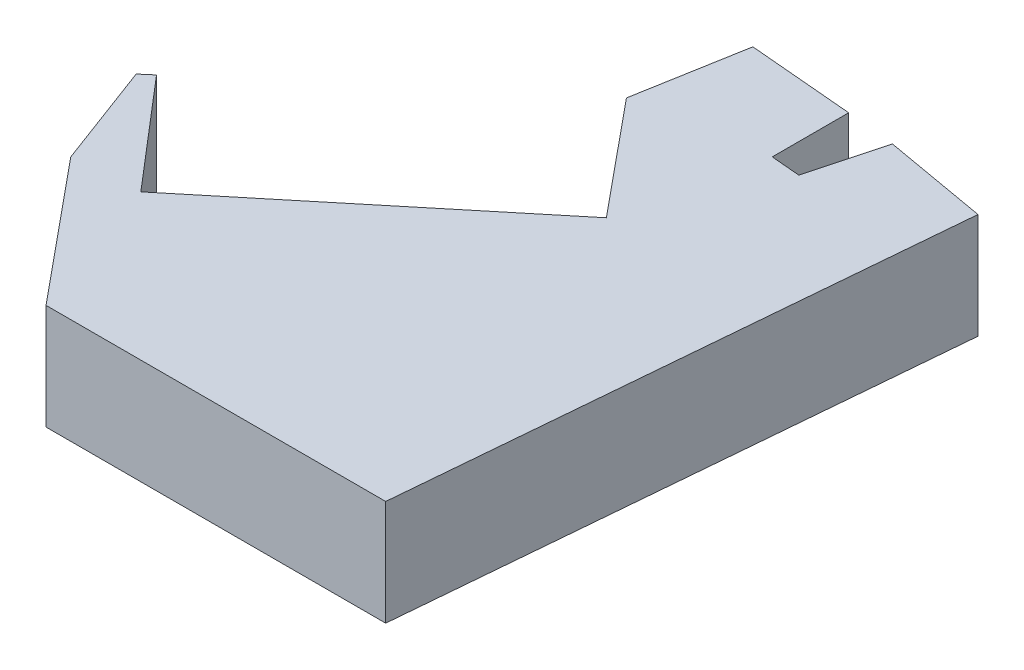
ISO-10303-21;
HEADER;
FILE_DESCRIPTION(('STEP AP214'),'2;1');
FILE_NAME('part.step','',(''),(''),'','','');
FILE_SCHEMA(('AUTOMOTIVE_DESIGN { 1 0 10303 214 1 1 1 1 }'));
ENDSEC;
DATA;
#1=APPLICATION_CONTEXT('core data for automotive mechanical design processes');
#2=APPLICATION_PROTOCOL_DEFINITION('international standard','automotive_design',2000,#1);
#3=PRODUCT_CONTEXT('',#1,'mechanical');
#4=PRODUCT('Part','Part','',(#3));
#5=PRODUCT_RELATED_PRODUCT_CATEGORY('part','',(#4));
#6=PRODUCT_DEFINITION_FORMATION('','',#4);
#7=PRODUCT_DEFINITION_CONTEXT('part definition',#1,'design');
#8=PRODUCT_DEFINITION('design','',#6,#7);
#9=PRODUCT_DEFINITION_SHAPE('','',#8);
#10=(LENGTH_UNIT() NAMED_UNIT(*) SI_UNIT(.MILLI.,.METRE.));
#11=(NAMED_UNIT(*) PLANE_ANGLE_UNIT() SI_UNIT($,.RADIAN.));
#12=(NAMED_UNIT(*) SI_UNIT($,.STERADIAN.) SOLID_ANGLE_UNIT());
#13=UNCERTAINTY_MEASURE_WITH_UNIT(LENGTH_MEASURE(1.E-05),#10,'distance_accuracy_value','');
#14=(GEOMETRIC_REPRESENTATION_CONTEXT(3) GLOBAL_UNCERTAINTY_ASSIGNED_CONTEXT((#13)) GLOBAL_UNIT_ASSIGNED_CONTEXT((#10,
#11,#12)) REPRESENTATION_CONTEXT('',''));
#15=CARTESIAN_POINT('',(0.,0.,0.));
#16=DIRECTION('',(0.,0.,1.));
#17=DIRECTION('',(1.,0.,0.));
#18=AXIS2_PLACEMENT_3D('',#15,#16,#17);
#19=CARTESIAN_POINT('',(0.,18.,0.));
#20=DIRECTION('',(0.771700164205839,0.,-0.635986522313706));
#21=DIRECTION('',(-0.635986522313706,0.,-0.771700164205839));
#22=AXIS2_PLACEMENT_3D('',#19,#20,#21);
#23=PLANE('',#22);
#24=DIRECTION('',(0.635986522313706,0.,0.771700164205839));
#25=VECTOR('',#24,1.);
#26=CARTESIAN_POINT('',(0.,0.,0.));
#27=LINE('',#26,#25);
#28=CARTESIAN_POINT('',(-19.8335297427731,0.,-24.0658215579761));
#29=VERTEX_POINT('',#28);
#30=CARTESIAN_POINT('',(0.,0.,0.));
#31=VERTEX_POINT('',#30);
#32=EDGE_CURVE('E167',#29,#31,#27,.T.);
#33=ORIENTED_EDGE('',*,*,#32,.T.);
#34=DIRECTION('',(0.,-1.,0.));
#35=VECTOR('',#34,1.);
#36=CARTESIAN_POINT('',(0.,18.,0.));
#37=LINE('',#36,#35);
#38=CARTESIAN_POINT('',(0.,18.,0.));
#39=VERTEX_POINT('',#38);
#40=EDGE_CURVE('E11',#39,#31,#37,.T.);
#41=ORIENTED_EDGE('',*,*,#40,.F.);
#42=DIRECTION('',(0.635986522313706,0.,0.771700164205839));
#43=VECTOR('',#42,1.);
#44=CARTESIAN_POINT('',(0.,18.,0.));
#45=LINE('',#44,#43);
#46=CARTESIAN_POINT('',(-19.8335297427731,18.,-24.0658215579761));
#47=VERTEX_POINT('',#46);
#48=EDGE_CURVE('E193',#47,#39,#45,.T.);
#49=ORIENTED_EDGE('',*,*,#48,.F.);
#50=DIRECTION('',(0.,-1.,0.));
#51=VECTOR('',#50,1.);
#52=CARTESIAN_POINT('',(-19.8335297427731,18.,-24.0658215579761));
#53=LINE('',#52,#51);
#54=EDGE_CURVE('E163',#47,#29,#53,.T.);
#55=ORIENTED_EDGE('',*,*,#54,.T.);
#56=EDGE_LOOP('',(#33,#41,#49,#55));
#57=FACE_BOUND('',#56,.T.);
#58=ADVANCED_FACE('F35',(#57),#23,.F.);
#59=CARTESIAN_POINT('',(0.,18.,0.));
#60=DIRECTION('',(0.,0.,-1.));
#61=DIRECTION('',(-1.,0.,0.));
#62=AXIS2_PLACEMENT_3D('',#59,#60,#61);
#63=PLANE('',#62);
#64=DIRECTION('',(1.,0.,0.));
#65=VECTOR('',#64,1.);
#66=CARTESIAN_POINT('',(0.,0.,0.));
#67=LINE('',#66,#65);
#68=CARTESIAN_POINT('',(58.,0.,0.));
#69=VERTEX_POINT('',#68);
#70=EDGE_CURVE('E170',#31,#69,#67,.T.);
#71=ORIENTED_EDGE('',*,*,#70,.T.);
#72=DIRECTION('',(0.,-1.,0.));
#73=VECTOR('',#72,1.);
#74=CARTESIAN_POINT('',(58.,18.,0.));
#75=LINE('',#74,#73);
#76=CARTESIAN_POINT('',(58.,18.,0.));
#77=VERTEX_POINT('',#76);
#78=EDGE_CURVE('E43',#77,#69,#75,.T.);
#79=ORIENTED_EDGE('',*,*,#78,.F.);
#80=DIRECTION('',(1.,0.,0.));
#81=VECTOR('',#80,1.);
#82=CARTESIAN_POINT('',(0.,18.,0.));
#83=LINE('',#82,#81);
#84=EDGE_CURVE('E112',#39,#77,#83,.T.);
#85=ORIENTED_EDGE('',*,*,#84,.F.);
#86=ORIENTED_EDGE('',*,*,#40,.T.);
#87=EDGE_LOOP('',(#71,#79,#85,#86));
#88=FACE_BOUND('',#87,.T.);
#89=ADVANCED_FACE('F281',(#88),#63,.F.);
#90=CARTESIAN_POINT('',(58.,18.,0.));
#91=DIRECTION('',(-0.996194698091746,0.,-0.0871557427476544));
#92=DIRECTION('',(-0.0871557427476544,0.,0.996194698091746));
#93=AXIS2_PLACEMENT_3D('',#90,#91,#92);
#94=PLANE('',#93);
#95=DIRECTION('',(0.0871557427476544,0.,-0.996194698091746));
#96=VECTOR('',#95,1.);
#97=CARTESIAN_POINT('',(58.,0.,0.));
#98=LINE('',#97,#96);
#99=CARTESIAN_POINT('',(66.1364457079106,0.,-93.));
#100=VERTEX_POINT('',#99);
#101=EDGE_CURVE('E172',#69,#100,#98,.T.);
#102=ORIENTED_EDGE('',*,*,#101,.T.);
#103=DIRECTION('',(0.,-1.,0.));
#104=VECTOR('',#103,1.);
#105=CARTESIAN_POINT('',(66.1364457079106,18.,-93.));
#106=LINE('',#105,#104);
#107=CARTESIAN_POINT('',(66.1364457079106,18.,-93.));
#108=VERTEX_POINT('',#107);
#109=EDGE_CURVE('E218',#108,#100,#106,.T.);
#110=ORIENTED_EDGE('',*,*,#109,.F.);
#111=DIRECTION('',(0.0871557427476544,0.,-0.996194698091746));
#112=VECTOR('',#111,1.);
#113=CARTESIAN_POINT('',(58.,18.,0.));
#114=LINE('',#113,#112);
#115=EDGE_CURVE('E226',#77,#108,#114,.T.);
#116=ORIENTED_EDGE('',*,*,#115,.F.);
#117=ORIENTED_EDGE('',*,*,#78,.T.);
#118=EDGE_LOOP('',(#102,#110,#116,#117));
#119=FACE_BOUND('',#118,.T.);
#120=ADVANCED_FACE('F224',(#119),#94,.F.);
#121=CARTESIAN_POINT('',(66.1364457079106,18.,-93.));
#122=DIRECTION('',(-0.173648177666924,0.,0.984807753012209));
#123=DIRECTION('',(0.984807753012209,0.,0.173648177666924));
#124=AXIS2_PLACEMENT_3D('',#121,#122,#123);
#125=PLANE('',#124);
#126=DIRECTION('',(-0.984807753012209,0.,-0.173648177666924));
#127=VECTOR('',#126,1.);
#128=CARTESIAN_POINT('',(66.1364457079106,0.,-93.));
#129=LINE('',#128,#127);
#130=CARTESIAN_POINT('',(48.4099061536908,0.,-96.1256671980046));
#131=VERTEX_POINT('',#130);
#132=EDGE_CURVE('E174',#100,#131,#129,.T.);
#133=ORIENTED_EDGE('',*,*,#132,.T.);
#134=DIRECTION('',(0.,-1.,0.));
#135=VECTOR('',#134,1.);
#136=CARTESIAN_POINT('',(48.4099061536908,18.,-96.1256671980046));
#137=LINE('',#136,#135);
#138=CARTESIAN_POINT('',(48.4099061536908,18.,-96.1256671980046));
#139=VERTEX_POINT('',#138);
#140=EDGE_CURVE('E215',#139,#131,#137,.T.);
#141=ORIENTED_EDGE('',*,*,#140,.F.);
#142=DIRECTION('',(-0.984807753012209,0.,-0.173648177666924));
#143=VECTOR('',#142,1.);
#144=CARTESIAN_POINT('',(66.1364457079106,18.,-93.));
#145=LINE('',#144,#143);
#146=EDGE_CURVE('E244',#108,#139,#145,.T.);
#147=ORIENTED_EDGE('',*,*,#146,.F.);
#148=ORIENTED_EDGE('',*,*,#109,.T.);
#149=EDGE_LOOP('',(#133,#141,#147,#148));
#150=FACE_BOUND('',#149,.T.);
#151=ADVANCED_FACE('F235',(#150),#125,.F.);
#152=CARTESIAN_POINT('',(48.4099061536908,18.,-96.1256671980046));
#153=DIRECTION('',(0.965925826289071,0.,0.258819045102511));
#154=DIRECTION('',(0.258819045102511,0.,-0.965925826289071));
#155=AXIS2_PLACEMENT_3D('',#152,#153,#154);
#156=PLANE('',#155);
#157=DIRECTION('',(-0.258819045102511,0.,0.965925826289071));
#158=VECTOR('',#157,1.);
#159=CARTESIAN_POINT('',(48.4099061536908,0.,-96.1256671980046));
#160=LINE('',#159,#158);
#161=CARTESIAN_POINT('',(45.0324061601878,0.,-83.5206656196872));
#162=VERTEX_POINT('',#161);
#163=EDGE_CURVE('E176',#131,#162,#160,.T.);
#164=ORIENTED_EDGE('',*,*,#163,.T.);
#165=DIRECTION('',(0.,-1.,0.));
#166=VECTOR('',#165,1.);
#167=CARTESIAN_POINT('',(45.0324061601878,18.,-83.5206656196872));
#168=LINE('',#167,#166);
#169=CARTESIAN_POINT('',(45.0324061601878,18.,-83.5206656196872));
#170=VERTEX_POINT('',#169);
#171=EDGE_CURVE('E212',#170,#162,#168,.T.);
#172=ORIENTED_EDGE('',*,*,#171,.F.);
#173=DIRECTION('',(-0.258819045102511,0.,0.965925826289071));
#174=VECTOR('',#173,1.);
#175=CARTESIAN_POINT('',(48.4099061536908,18.,-96.1256671980046));
#176=LINE('',#175,#174);
#177=EDGE_CURVE('E241',#139,#170,#176,.T.);
#178=ORIENTED_EDGE('',*,*,#177,.F.);
#179=ORIENTED_EDGE('',*,*,#140,.T.);
#180=EDGE_LOOP('',(#164,#172,#178,#179));
#181=FACE_BOUND('',#180,.T.);
#182=ADVANCED_FACE('F239',(#181),#156,.F.);
#183=CARTESIAN_POINT('',(45.0324061601878,18.,-83.5206656196872));
#184=DIRECTION('',(-0.0871557427476548,0.,0.996194698091746));
#185=DIRECTION('',(0.996194698091746,0.,0.0871557427476548));
#186=AXIS2_PLACEMENT_3D('',#183,#184,#185);
#187=PLANE('',#186);
#188=DIRECTION('',(-0.996194698091746,0.,-0.0871557427476548));
#189=VECTOR('',#188,1.);
#190=CARTESIAN_POINT('',(45.0324061601878,0.,-83.5206656196872));
#191=LINE('',#190,#189);
#192=CARTESIAN_POINT('',(40.051432669729,0.,-83.9564443334254));
#193=VERTEX_POINT('',#192);
#194=EDGE_CURVE('E178',#162,#193,#191,.T.);
#195=ORIENTED_EDGE('',*,*,#194,.T.);
#196=DIRECTION('',(0.,-1.,0.));
#197=VECTOR('',#196,1.);
#198=CARTESIAN_POINT('',(40.051432669729,18.,-83.9564443334254));
#199=LINE('',#198,#197);
#200=CARTESIAN_POINT('',(40.051432669729,18.,-83.9564443334254));
#201=VERTEX_POINT('',#200);
#202=EDGE_CURVE('E209',#201,#193,#199,.T.);
#203=ORIENTED_EDGE('',*,*,#202,.F.);
#204=DIRECTION('',(-0.996194698091746,0.,-0.0871557427476548));
#205=VECTOR('',#204,1.);
#206=CARTESIAN_POINT('',(45.0324061601878,18.,-83.5206656196872));
#207=LINE('',#206,#205);
#208=EDGE_CURVE('E243',#170,#201,#207,.T.);
#209=ORIENTED_EDGE('',*,*,#208,.F.);
#210=ORIENTED_EDGE('',*,*,#171,.T.);
#211=EDGE_LOOP('',(#195,#203,#209,#210));
#212=FACE_BOUND('',#211,.T.);
#213=ADVANCED_FACE('F294',(#212),#187,.F.);
#214=CARTESIAN_POINT('',(40.051432669729,18.,-83.9564443334254));
#215=DIRECTION('',(-1.,0.,0.));
#216=DIRECTION('',(0.,0.,1.));
#217=AXIS2_PLACEMENT_3D('',#214,#215,#216);
#218=PLANE('',#217);
#219=DIRECTION('',(0.,0.,-1.));
#220=VECTOR('',#219,1.);
#221=CARTESIAN_POINT('',(40.051432669729,0.,-83.9564443334254));
#222=LINE('',#221,#220);
#223=CARTESIAN_POINT('',(40.051432669729,0.,-97.0061022214889));
#224=VERTEX_POINT('',#223);
#225=EDGE_CURVE('E180',#193,#224,#222,.T.);
#226=ORIENTED_EDGE('',*,*,#225,.T.);
#227=DIRECTION('',(0.,-1.,0.));
#228=VECTOR('',#227,1.);
#229=CARTESIAN_POINT('',(40.051432669729,18.,-97.0061022214889));
#230=LINE('',#229,#228);
#231=CARTESIAN_POINT('',(40.051432669729,18.,-97.0061022214889));
#232=VERTEX_POINT('',#231);
#233=EDGE_CURVE('E206',#232,#224,#230,.T.);
#234=ORIENTED_EDGE('',*,*,#233,.F.);
#235=DIRECTION('',(0.,0.,-1.));
#236=VECTOR('',#235,1.);
#237=CARTESIAN_POINT('',(40.051432669729,18.,-83.9564443334254));
#238=LINE('',#237,#236);
#239=EDGE_CURVE('E246',#201,#232,#238,.T.);
#240=ORIENTED_EDGE('',*,*,#239,.F.);
#241=ORIENTED_EDGE('',*,*,#202,.T.);
#242=EDGE_LOOP('',(#226,#234,#240,#241));
#243=FACE_BOUND('',#242,.T.);
#244=ADVANCED_FACE('F297',(#243),#218,.F.);
#245=CARTESIAN_POINT('',(40.051432669729,18.,-97.0061022214889));
#246=DIRECTION('',(-0.0871557427476512,0.,0.996194698091746));
#247=DIRECTION('',(0.996194698091746,0.,0.0871557427476512));
#248=AXIS2_PLACEMENT_3D('',#245,#246,#247);
#249=PLANE('',#248);
#250=DIRECTION('',(-0.996194698091746,0.,-0.0871557427476512));
#251=VECTOR('',#250,1.);
#252=CARTESIAN_POINT('',(40.051432669729,0.,-97.0061022214889));
#253=LINE('',#252,#251);
#254=CARTESIAN_POINT('',(22.1199281040776,0.,-98.5749055909467));
#255=VERTEX_POINT('',#254);
#256=EDGE_CURVE('E182',#224,#255,#253,.T.);
#257=ORIENTED_EDGE('',*,*,#256,.T.);
#258=DIRECTION('',(0.,-1.,0.));
#259=VECTOR('',#258,1.);
#260=CARTESIAN_POINT('',(22.1199281040776,18.,-98.5749055909467));
#261=LINE('',#260,#259);
#262=CARTESIAN_POINT('',(22.1199281040776,18.,-98.5749055909467));
#263=VERTEX_POINT('',#262);
#264=EDGE_CURVE('E203',#263,#255,#261,.T.);
#265=ORIENTED_EDGE('',*,*,#264,.F.);
#266=DIRECTION('',(-0.996194698091746,0.,-0.0871557427476512));
#267=VECTOR('',#266,1.);
#268=CARTESIAN_POINT('',(40.051432669729,18.,-97.0061022214889));
#269=LINE('',#268,#267);
#270=EDGE_CURVE('E252',#232,#263,#269,.T.);
#271=ORIENTED_EDGE('',*,*,#270,.F.);
#272=ORIENTED_EDGE('',*,*,#233,.T.);
#273=EDGE_LOOP('',(#257,#265,#271,#272));
#274=FACE_BOUND('',#273,.T.);
#275=ADVANCED_FACE('F301',(#274),#249,.F.);
#276=CARTESIAN_POINT('',(22.1199281040776,18.,-98.5749055909467));
#277=DIRECTION('',(0.98480775301221,0.,0.17364817766692));
#278=DIRECTION('',(0.17364817766692,0.,-0.98480775301221));
#279=AXIS2_PLACEMENT_3D('',#276,#277,#278);
#280=PLANE('',#279);
#281=DIRECTION('',(-0.17364817766692,0.,0.98480775301221));
#282=VECTOR('',#281,1.);
#283=CARTESIAN_POINT('',(22.1199281040776,0.,-98.5749055909467));
#284=LINE('',#283,#282);
#285=CARTESIAN_POINT('',(18.8832214469573,0.,-80.2186299709839));
#286=VERTEX_POINT('',#285);
#287=EDGE_CURVE('E184',#255,#286,#284,.T.);
#288=ORIENTED_EDGE('',*,*,#287,.T.);
#289=DIRECTION('',(0.,-1.,0.));
#290=VECTOR('',#289,1.);
#291=CARTESIAN_POINT('',(18.8832214469573,18.,-80.2186299709839));
#292=LINE('',#291,#290);
#293=CARTESIAN_POINT('',(18.8832214469573,18.,-80.2186299709839));
#294=VERTEX_POINT('',#293);
#295=EDGE_CURVE('E200',#294,#286,#292,.T.);
#296=ORIENTED_EDGE('',*,*,#295,.F.);
#297=DIRECTION('',(-0.17364817766692,0.,0.98480775301221));
#298=VECTOR('',#297,1.);
#299=CARTESIAN_POINT('',(22.1199281040776,18.,-98.5749055909467));
#300=LINE('',#299,#298);
#301=EDGE_CURVE('E254',#263,#294,#300,.T.);
#302=ORIENTED_EDGE('',*,*,#301,.F.);
#303=ORIENTED_EDGE('',*,*,#264,.T.);
#304=EDGE_LOOP('',(#288,#296,#302,#303));
#305=FACE_BOUND('',#304,.T.);
#306=ADVANCED_FACE('F305',(#305),#280,.F.);
#307=CARTESIAN_POINT('',(34.8936794858975,18.,-60.79168826047));
#308=DIRECTION('',(0.771700164205839,0.,-0.635986522313706));
#309=DIRECTION('',(-0.635986522313706,0.,-0.771700164205839));
#310=AXIS2_PLACEMENT_3D('',#307,#308,#309);
#311=PLANE('',#310);
#312=DIRECTION('',(0.635986522313706,0.,0.771700164205839));
#313=VECTOR('',#312,1.);
#314=CARTESIAN_POINT('',(34.8936794858975,0.,-60.79168826047));
#315=LINE('',#314,#313);
#316=CARTESIAN_POINT('',(34.8936794858975,0.,-60.79168826047));
#317=VERTEX_POINT('',#316);
#318=EDGE_CURVE('E186',#286,#317,#315,.T.);
#319=ORIENTED_EDGE('',*,*,#318,.T.);
#320=DIRECTION('',(0.,-1.,0.));
#321=VECTOR('',#320,1.);
#322=CARTESIAN_POINT('',(34.8936794858975,18.,-60.79168826047));
#323=LINE('',#322,#321);
#324=CARTESIAN_POINT('',(34.8936794858975,18.,-60.79168826047));
#325=VERTEX_POINT('',#324);
#326=EDGE_CURVE('E197',#325,#317,#323,.T.);
#327=ORIENTED_EDGE('',*,*,#326,.F.);
#328=DIRECTION('',(0.635986522313706,0.,0.771700164205839));
#329=VECTOR('',#328,1.);
#330=CARTESIAN_POINT('',(34.8936794858975,18.,-60.79168826047));
#331=LINE('',#330,#329);
#332=EDGE_CURVE('E256',#294,#325,#331,.T.);
#333=ORIENTED_EDGE('',*,*,#332,.F.);
#334=ORIENTED_EDGE('',*,*,#295,.T.);
#335=EDGE_LOOP('',(#319,#327,#333,#334));
#336=FACE_BOUND('',#335,.T.);
#337=ADVANCED_FACE('F262',(#336),#311,.F.);
#338=CARTESIAN_POINT('',(-8.6850884928201,18.,-24.8768208300313));
#339=DIRECTION('',(0.635986522313706,0.,0.771700164205839));
#340=DIRECTION('',(0.771700164205839,0.,-0.635986522313706));
#341=AXIS2_PLACEMENT_3D('',#338,#339,#340);
#342=PLANE('',#341);
#343=DIRECTION('',(-0.771700164205839,0.,0.635986522313706));
#344=VECTOR('',#343,1.);
#345=CARTESIAN_POINT('',(-8.6850884928201,0.,-24.8768208300313));
#346=LINE('',#345,#344);
#347=CARTESIAN_POINT('',(-8.6850884928201,0.,-24.8768208300313));
#348=VERTEX_POINT('',#347);
#349=EDGE_CURVE('E188',#317,#348,#346,.T.);
#350=ORIENTED_EDGE('',*,*,#349,.T.);
#351=DIRECTION('',(0.,-1.,0.));
#352=VECTOR('',#351,1.);
#353=CARTESIAN_POINT('',(-8.6850884928201,18.,-24.8768208300313));
#354=LINE('',#353,#352);
#355=CARTESIAN_POINT('',(-8.6850884928201,18.,-24.8768208300313));
#356=VERTEX_POINT('',#355);
#357=EDGE_CURVE('E158',#356,#348,#354,.T.);
#358=ORIENTED_EDGE('',*,*,#357,.F.);
#359=DIRECTION('',(-0.771700164205839,0.,0.635986522313706));
#360=VECTOR('',#359,1.);
#361=CARTESIAN_POINT('',(-8.6850884928201,18.,-24.8768208300313));
#362=LINE('',#361,#360);
#363=EDGE_CURVE('E149',#325,#356,#362,.T.);
#364=ORIENTED_EDGE('',*,*,#363,.F.);
#365=ORIENTED_EDGE('',*,*,#326,.T.);
#366=EDGE_LOOP('',(#350,#358,#364,#365));
#367=FACE_BOUND('',#366,.T.);
#368=ADVANCED_FACE('F266',(#367),#342,.F.);
#369=CARTESIAN_POINT('',(-24.6350939992342,18.,-43.5035697620843));
#370=DIRECTION('',(-0.759574456156183,0.,0.650420360655353));
#371=DIRECTION('',(0.650420360655353,0.,0.759574456156183));
#372=AXIS2_PLACEMENT_3D('',#369,#370,#371);
#373=PLANE('',#372);
#374=DIRECTION('',(-0.650420360655353,0.,-0.759574456156183));
#375=VECTOR('',#374,1.);
#376=CARTESIAN_POINT('',(-24.6350939992342,0.,-43.5035697620843));
#377=LINE('',#376,#375);
#378=CARTESIAN_POINT('',(-24.6350939992342,0.,-43.5035697620843));
#379=VERTEX_POINT('',#378);
#380=EDGE_CURVE('E157',#348,#379,#377,.T.);
#381=ORIENTED_EDGE('',*,*,#380,.T.);
#382=DIRECTION('',(0.,-1.,0.));
#383=VECTOR('',#382,1.);
#384=CARTESIAN_POINT('',(-24.6350939992342,18.,-43.5035697620843));
#385=LINE('',#384,#383);
#386=CARTESIAN_POINT('',(-24.6350939992342,18.,-43.5035697620843));
#387=VERTEX_POINT('',#386);
#388=EDGE_CURVE('E154',#387,#379,#385,.T.);
#389=ORIENTED_EDGE('',*,*,#388,.F.);
#390=DIRECTION('',(-0.650420360655353,0.,-0.759574456156183));
#391=VECTOR('',#390,1.);
#392=CARTESIAN_POINT('',(-24.6350939992342,18.,-43.5035697620843));
#393=LINE('',#392,#391);
#394=EDGE_CURVE('E143',#356,#387,#393,.T.);
#395=ORIENTED_EDGE('',*,*,#394,.F.);
#396=ORIENTED_EDGE('',*,*,#357,.T.);
#397=EDGE_LOOP('',(#381,#389,#395,#396));
#398=FACE_BOUND('',#397,.T.);
#399=ADVANCED_FACE('F155',(#398),#373,.F.);
#400=CARTESIAN_POINT('',(-24.6350939992342,18.,-43.5035697620843));
#401=DIRECTION('',(0.650420360655353,0.,0.759574456156182));
#402=DIRECTION('',(0.759574456156183,0.,-0.650420360655353));
#403=AXIS2_PLACEMENT_3D('',#400,#401,#402);
#404=PLANE('',#403);
#405=DIRECTION('',(-0.759574456156183,0.,0.650420360655353));
#406=VECTOR('',#405,1.);
#407=CARTESIAN_POINT('',(-24.6350939992342,0.,-43.5035697620843));
#408=LINE('',#407,#406);
#409=CARTESIAN_POINT('',(-26.5059232604727,0.,-41.9015866609449));
#410=VERTEX_POINT('',#409);
#411=EDGE_CURVE('E98',#379,#410,#408,.T.);
#412=ORIENTED_EDGE('',*,*,#411,.T.);
#413=DIRECTION('',(0.,-1.,0.));
#414=VECTOR('',#413,1.);
#415=CARTESIAN_POINT('',(-26.5059232604727,18.,-41.9015866609449));
#416=LINE('',#415,#414);
#417=CARTESIAN_POINT('',(-26.5059232604727,18.,-41.9015866609449));
#418=VERTEX_POINT('',#417);
#419=EDGE_CURVE('E159',#418,#410,#416,.T.);
#420=ORIENTED_EDGE('',*,*,#419,.F.);
#421=DIRECTION('',(-0.759574456156183,0.,0.650420360655353));
#422=VECTOR('',#421,1.);
#423=CARTESIAN_POINT('',(-24.6350939992342,18.,-43.5035697620843));
#424=LINE('',#423,#422);
#425=EDGE_CURVE('E147',#387,#418,#424,.T.);
#426=ORIENTED_EDGE('',*,*,#425,.F.);
#427=ORIENTED_EDGE('',*,*,#388,.T.);
#428=EDGE_LOOP('',(#412,#420,#426,#427));
#429=FACE_BOUND('',#428,.T.);
#430=ADVANCED_FACE('F161',(#429),#404,.F.);
#431=CARTESIAN_POINT('',(-26.5059232604727,18.,-41.9015866609449));
#432=DIRECTION('',(0.936605436305645,0.,-0.350385868269131));
#433=DIRECTION('',(-0.350385868269131,0.,-0.936605436305645));
#434=AXIS2_PLACEMENT_3D('',#431,#432,#433);
#435=PLANE('',#434);
#436=DIRECTION('',(0.350385868269131,0.,0.936605436305645));
#437=VECTOR('',#436,1.);
#438=CARTESIAN_POINT('',(-26.5059232604727,0.,-41.9015866609449));
#439=LINE('',#438,#437);
#440=EDGE_CURVE('E104',#410,#29,#439,.T.);
#441=ORIENTED_EDGE('',*,*,#440,.T.);
#442=ORIENTED_EDGE('',*,*,#54,.F.);
#443=DIRECTION('',(0.350385868269131,0.,0.936605436305645));
#444=VECTOR('',#443,1.);
#445=CARTESIAN_POINT('',(-26.5059232604727,18.,-41.9015866609449));
#446=LINE('',#445,#444);
#447=EDGE_CURVE('E51',#418,#47,#446,.T.);
#448=ORIENTED_EDGE('',*,*,#447,.F.);
#449=ORIENTED_EDGE('',*,*,#419,.T.);
#450=EDGE_LOOP('',(#441,#442,#448,#449));
#451=FACE_BOUND('',#450,.T.);
#452=ADVANCED_FACE('F270',(#451),#435,.F.);
#453=CARTESIAN_POINT('',(0.,18.,0.));
#454=DIRECTION('',(0.,-1.,0.));
#455=DIRECTION('',(0.,0.,-1.));
#456=AXIS2_PLACEMENT_3D('',#453,#454,#455);
#457=PLANE('',#456);
#458=ORIENTED_EDGE('',*,*,#48,.T.);
#459=ORIENTED_EDGE('',*,*,#84,.T.);
#460=ORIENTED_EDGE('',*,*,#115,.T.);
#461=ORIENTED_EDGE('',*,*,#146,.T.);
#462=ORIENTED_EDGE('',*,*,#177,.T.);
#463=ORIENTED_EDGE('',*,*,#208,.T.);
#464=ORIENTED_EDGE('',*,*,#239,.T.);
#465=ORIENTED_EDGE('',*,*,#270,.T.);
#466=ORIENTED_EDGE('',*,*,#301,.T.);
#467=ORIENTED_EDGE('',*,*,#332,.T.);
#468=ORIENTED_EDGE('',*,*,#363,.T.);
#469=ORIENTED_EDGE('',*,*,#394,.T.);
#470=ORIENTED_EDGE('',*,*,#425,.T.);
#471=ORIENTED_EDGE('',*,*,#447,.T.);
#472=EDGE_LOOP('',(#458,#459,#460,#461,#462,#463,#464,#465,#466,#467,#468,#469,#470,#471));
#473=FACE_BOUND('',#472,.T.);
#474=ADVANCED_FACE('F145',(#473),#457,.F.);
#475=CARTESIAN_POINT('',(0.,0.,0.));
#476=DIRECTION('',(0.,-1.,0.));
#477=DIRECTION('',(0.,0.,-1.));
#478=AXIS2_PLACEMENT_3D('',#475,#476,#477);
#479=PLANE('',#478);
#480=ORIENTED_EDGE('',*,*,#32,.F.);
#481=ORIENTED_EDGE('',*,*,#440,.F.);
#482=ORIENTED_EDGE('',*,*,#411,.F.);
#483=ORIENTED_EDGE('',*,*,#380,.F.);
#484=ORIENTED_EDGE('',*,*,#349,.F.);
#485=ORIENTED_EDGE('',*,*,#318,.F.);
#486=ORIENTED_EDGE('',*,*,#287,.F.);
#487=ORIENTED_EDGE('',*,*,#256,.F.);
#488=ORIENTED_EDGE('',*,*,#225,.F.);
#489=ORIENTED_EDGE('',*,*,#194,.F.);
#490=ORIENTED_EDGE('',*,*,#163,.F.);
#491=ORIENTED_EDGE('',*,*,#132,.F.);
#492=ORIENTED_EDGE('',*,*,#101,.F.);
#493=ORIENTED_EDGE('',*,*,#70,.F.);
#494=EDGE_LOOP('',(#480,#481,#482,#483,#484,#485,#486,#487,#488,#489,#490,#491,#492,#493));
#495=FACE_BOUND('',#494,.T.);
#496=ADVANCED_FACE('F230',(#495),#479,.T.);
#497=CLOSED_SHELL('',(#58,#89,#120,#151,#182,#213,#244,#275,#306,#337,#368,#399,#430,#452,#474,#496));
#498=MANIFOLD_SOLID_BREP('B2',#497);
#499=ADVANCED_BREP_SHAPE_REPRESENTATION('',(#18,#498),#14);
#500=SHAPE_DEFINITION_REPRESENTATION(#9,#499);
ENDSEC;
END-ISO-10303-21;
